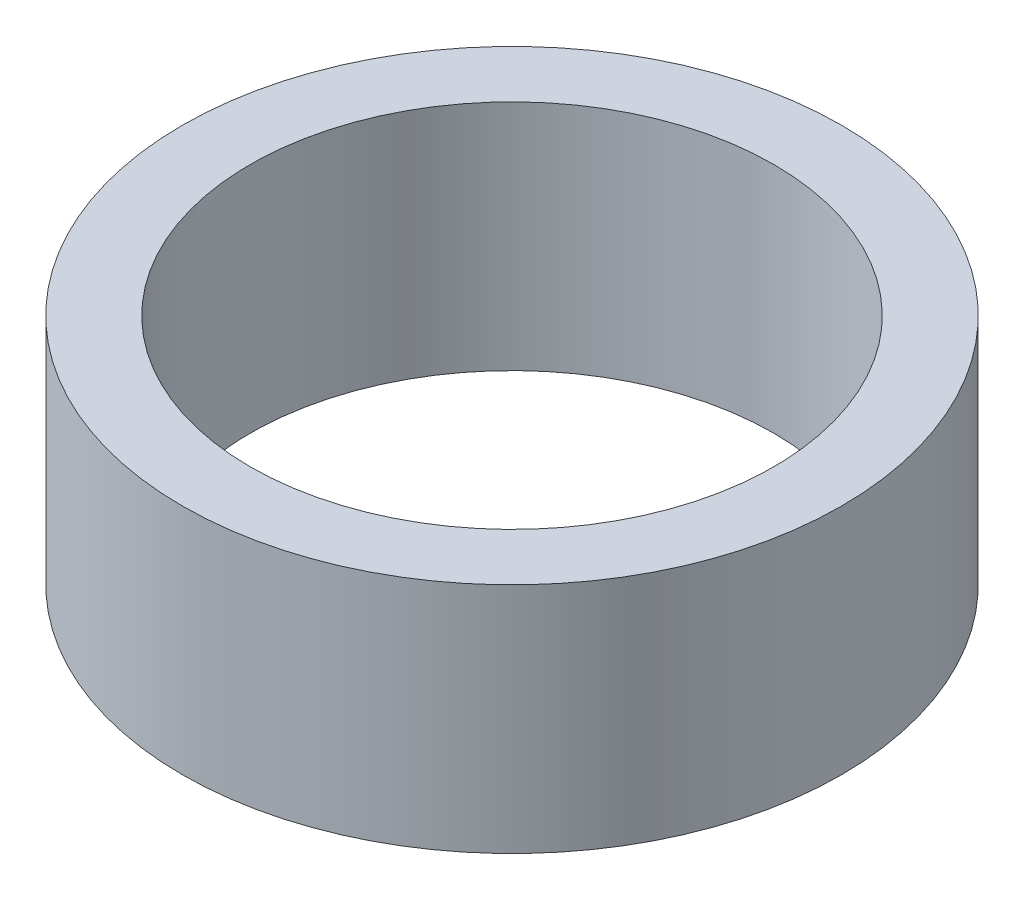
ISO-10303-21;
HEADER;
FILE_DESCRIPTION(('STEP AP214'),'2;1');
FILE_NAME('part.step','',(''),(''),'','','');
FILE_SCHEMA(('AUTOMOTIVE_DESIGN { 1 0 10303 214 1 1 1 1 }'));
ENDSEC;
DATA;
#1=APPLICATION_CONTEXT('core data for automotive mechanical design processes');
#2=APPLICATION_PROTOCOL_DEFINITION('international standard','automotive_design',2000,#1);
#3=PRODUCT_CONTEXT('',#1,'mechanical');
#4=PRODUCT('Part','Part','',(#3));
#5=PRODUCT_RELATED_PRODUCT_CATEGORY('part','',(#4));
#6=PRODUCT_DEFINITION_FORMATION('','',#4);
#7=PRODUCT_DEFINITION_CONTEXT('part definition',#1,'design');
#8=PRODUCT_DEFINITION('design','',#6,#7);
#9=PRODUCT_DEFINITION_SHAPE('','',#8);
#10=(LENGTH_UNIT() NAMED_UNIT(*) SI_UNIT(.MILLI.,.METRE.));
#11=(NAMED_UNIT(*) PLANE_ANGLE_UNIT() SI_UNIT($,.RADIAN.));
#12=(NAMED_UNIT(*) SI_UNIT($,.STERADIAN.) SOLID_ANGLE_UNIT());
#13=UNCERTAINTY_MEASURE_WITH_UNIT(LENGTH_MEASURE(1.E-05),#10,'distance_accuracy_value','');
#14=(GEOMETRIC_REPRESENTATION_CONTEXT(3) GLOBAL_UNCERTAINTY_ASSIGNED_CONTEXT((#13)) GLOBAL_UNIT_ASSIGNED_CONTEXT((#10,
#11,#12)) REPRESENTATION_CONTEXT('',''));
#15=CARTESIAN_POINT('',(0.,0.,0.));
#16=DIRECTION('',(0.,0.,1.));
#17=DIRECTION('',(1.,0.,0.));
#18=AXIS2_PLACEMENT_3D('',#15,#16,#17);
#19=CARTESIAN_POINT('',(0.,7.,0.));
#20=DIRECTION('',(0.,1.,0.));
#21=DIRECTION('',(0.,0.,1.));
#22=AXIS2_PLACEMENT_3D('',#19,#20,#21);
#23=CYLINDRICAL_SURFACE('',#22,6.75);
#24=CARTESIAN_POINT('',(0.,4.,0.));
#25=DIRECTION('',(0.,1.,0.));
#26=DIRECTION('',(0.,0.,1.));
#27=AXIS2_PLACEMENT_3D('',#24,#25,#26);
#28=CIRCLE('',#27,6.75);
#29=CARTESIAN_POINT('',(0.,4.,6.75));
#30=VERTEX_POINT('',#29);
#31=EDGE_CURVE('E26',#30,#30,#28,.T.);
#32=ORIENTED_EDGE('',*,*,#31,.F.);
#33=EDGE_LOOP('',(#32));
#34=FACE_BOUND('',#33,.T.);
#35=CARTESIAN_POINT('',(0.,10.,0.));
#36=DIRECTION('',(0.,1.,0.));
#37=DIRECTION('',(0.,0.,1.));
#38=AXIS2_PLACEMENT_3D('',#35,#36,#37);
#39=CIRCLE('',#38,6.75);
#40=CARTESIAN_POINT('',(0.,10.,6.75));
#41=VERTEX_POINT('',#40);
#42=EDGE_CURVE('E17',#41,#41,#39,.F.);
#43=ORIENTED_EDGE('',*,*,#42,.F.);
#44=EDGE_LOOP('',(#43));
#45=FACE_BOUND('',#44,.T.);
#46=ADVANCED_FACE('F14',(#34,#45),#23,.F.);
#47=CARTESIAN_POINT('',(0.,10.,0.));
#48=DIRECTION('',(0.,1.,0.));
#49=DIRECTION('',(0.,0.,1.));
#50=AXIS2_PLACEMENT_3D('',#47,#48,#49);
#51=PLANE('',#50);
#52=CARTESIAN_POINT('',(0.,10.,0.));
#53=DIRECTION('',(0.,1.,0.));
#54=DIRECTION('',(0.,0.,1.));
#55=AXIS2_PLACEMENT_3D('',#52,#53,#54);
#56=CIRCLE('',#55,8.5);
#57=CARTESIAN_POINT('',(0.,10.,8.5));
#58=VERTEX_POINT('',#57);
#59=EDGE_CURVE('E21',#58,#58,#56,.F.);
#60=ORIENTED_EDGE('',*,*,#59,.F.);
#61=EDGE_LOOP('',(#60));
#62=FACE_BOUND('',#61,.T.);
#63=ORIENTED_EDGE('',*,*,#42,.T.);
#64=EDGE_LOOP('',(#63));
#65=FACE_BOUND('',#64,.T.);
#66=ADVANCED_FACE('F34',(#62,#65),#51,.T.);
#67=CARTESIAN_POINT('',(0.,4.,0.));
#68=DIRECTION('',(0.,-1.,0.));
#69=DIRECTION('',(0.,0.,-1.));
#70=AXIS2_PLACEMENT_3D('',#67,#68,#69);
#71=PLANE('',#70);
#72=CARTESIAN_POINT('',(0.,4.,0.));
#73=DIRECTION('',(0.,1.,0.));
#74=DIRECTION('',(0.,0.,1.));
#75=AXIS2_PLACEMENT_3D('',#72,#73,#74);
#76=CIRCLE('',#75,8.5);
#77=CARTESIAN_POINT('',(0.,4.,8.5));
#78=VERTEX_POINT('',#77);
#79=EDGE_CURVE('E10',#78,#78,#76,.T.);
#80=ORIENTED_EDGE('',*,*,#79,.F.);
#81=EDGE_LOOP('',(#80));
#82=FACE_BOUND('',#81,.T.);
#83=ORIENTED_EDGE('',*,*,#31,.T.);
#84=EDGE_LOOP('',(#83));
#85=FACE_BOUND('',#84,.T.);
#86=ADVANCED_FACE('F42',(#82,#85),#71,.T.);
#87=CARTESIAN_POINT('',(0.,7.,0.));
#88=DIRECTION('',(0.,1.,0.));
#89=DIRECTION('',(0.,0.,1.));
#90=AXIS2_PLACEMENT_3D('',#87,#88,#89);
#91=CYLINDRICAL_SURFACE('',#90,8.5);
#92=ORIENTED_EDGE('',*,*,#59,.T.);
#93=EDGE_LOOP('',(#92));
#94=FACE_BOUND('',#93,.T.);
#95=ORIENTED_EDGE('',*,*,#79,.T.);
#96=EDGE_LOOP('',(#95));
#97=FACE_BOUND('',#96,.T.);
#98=ADVANCED_FACE('F44',(#94,#97),#91,.T.);
#99=CLOSED_SHELL('',(#46,#66,#86,#98));
#100=MANIFOLD_SOLID_BREP('B1',#99);
#101=ADVANCED_BREP_SHAPE_REPRESENTATION('',(#18,#100),#14);
#102=SHAPE_DEFINITION_REPRESENTATION(#9,#101);
ENDSEC;
END-ISO-10303-21;
